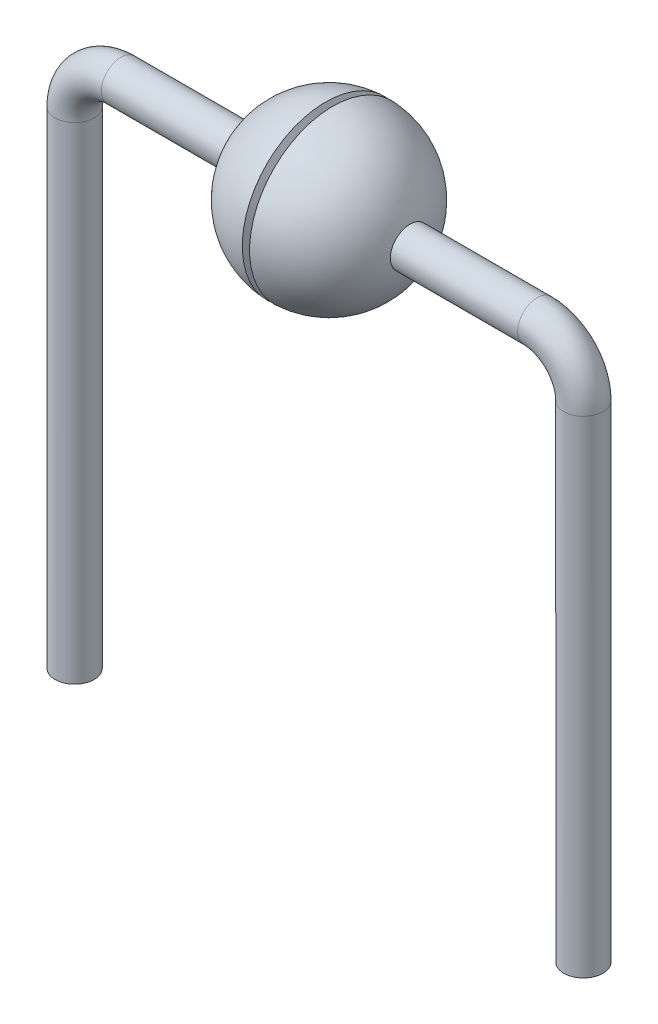
ISO-10303-21;
HEADER;
FILE_DESCRIPTION(('STEP AP214'),'2;1');
FILE_NAME('part.step','',(''),(''),'','','');
FILE_SCHEMA(('AUTOMOTIVE_DESIGN { 1 0 10303 214 1 1 1 1 }'));
ENDSEC;
DATA;
#1=APPLICATION_CONTEXT('core data for automotive mechanical design processes');
#2=APPLICATION_PROTOCOL_DEFINITION('international standard','automotive_design',2000,#1);
#3=PRODUCT_CONTEXT('',#1,'mechanical');
#4=PRODUCT('Part','Part','',(#3));
#5=PRODUCT_RELATED_PRODUCT_CATEGORY('part','',(#4));
#6=PRODUCT_DEFINITION_FORMATION('','',#4);
#7=PRODUCT_DEFINITION_CONTEXT('part definition',#1,'design');
#8=PRODUCT_DEFINITION('design','',#6,#7);
#9=PRODUCT_DEFINITION_SHAPE('','',#8);
#10=(LENGTH_UNIT() NAMED_UNIT(*) SI_UNIT(.MILLI.,.METRE.));
#11=(NAMED_UNIT(*) PLANE_ANGLE_UNIT() SI_UNIT($,.RADIAN.));
#12=(NAMED_UNIT(*) SI_UNIT($,.STERADIAN.) SOLID_ANGLE_UNIT());
#13=UNCERTAINTY_MEASURE_WITH_UNIT(LENGTH_MEASURE(1.E-05),#10,'distance_accuracy_value','');
#14=(GEOMETRIC_REPRESENTATION_CONTEXT(3) GLOBAL_UNCERTAINTY_ASSIGNED_CONTEXT((#13)) GLOBAL_UNIT_ASSIGNED_CONTEXT((#10,
#11,#12)) REPRESENTATION_CONTEXT('',''));
#15=CARTESIAN_POINT('',(0.,0.,0.));
#16=DIRECTION('',(0.,0.,1.));
#17=DIRECTION('',(1.,0.,0.));
#18=AXIS2_PLACEMENT_3D('',#15,#16,#17);
#19=CARTESIAN_POINT('',(0.,0.,0.));
#20=DIRECTION('',(-1.,0.,0.));
#21=DIRECTION('',(0.,0.,-1.));
#22=AXIS2_PLACEMENT_3D('',#19,#20,#21);
#23=SPHERICAL_SURFACE('',#22,1.8);
#24=CARTESIAN_POINT('',(-0.0757594654296964,0.,0.));
#25=DIRECTION('',(-1.,0.,0.));
#26=DIRECTION('',(0.,0.,1.));
#27=AXIS2_PLACEMENT_3D('',#24,#25,#26);
#28=CIRCLE('',#27,1.79840498870466);
#29=CARTESIAN_POINT('',(-0.0757594654296965,0.,-1.79840498870466));
#30=VERTEX_POINT('',#29);
#31=EDGE_CURVE('E51',#30,#30,#28,.T.);
#32=CARTESIAN_POINT('',(-1.74957838479417,0.,0.));
#33=DIRECTION('',(-1.,0.,0.));
#34=DIRECTION('',(0.,0.,1.));
#35=AXIS2_PLACEMENT_3D('',#32,#33,#34);
#36=CIRCLE('',#35,0.423054931966296);
#37=CARTESIAN_POINT('',(-1.74957838479417,0.,-0.423054931966299));
#38=VERTEX_POINT('',#37);
#39=EDGE_CURVE('E10',#38,#38,#36,.T.);
#40=CARTESIAN_POINT('',(-0.0757594654296965,0.,-1.79840498870466));
#41=CARTESIAN_POINT('',(-0.099952631636869,0.,-1.79738611513024));
#42=CARTESIAN_POINT('',(-0.124125188852358,0.,-1.79587849255321));
#43=CARTESIAN_POINT('',(-0.172389823168664,0.,-1.79188945530046));
#44=CARTESIAN_POINT('',(-0.196481900269483,0.,-1.78940804062473));
#45=CARTESIAN_POINT('',(-0.244546312225146,0.,-1.78347512508105));
#46=CARTESIAN_POINT('',(-0.268518647079991,0.,-1.7800236242131));
#47=CARTESIAN_POINT('',(-0.316304542533428,0.,-1.77215624692101));
#48=CARTESIAN_POINT('',(-0.340118103132021,0.,-1.76774037049687));
#49=CARTESIAN_POINT('',(-0.387547667219825,0.,-1.75795140937531));
#50=CARTESIAN_POINT('',(-0.411163670709036,0.,-1.75257832467788));
#51=CARTESIAN_POINT('',(-0.458159661972075,0.,-1.74088370363389));
#52=CARTESIAN_POINT('',(-0.481539649745902,0.,-1.73456216728732));
#53=CARTESIAN_POINT('',(-0.528025534652932,0.,-1.72098093596718));
#54=CARTESIAN_POINT('',(-0.551131431786133,0.,-1.71372124099362));
#55=CARTESIAN_POINT('',(-0.59703150702984,0.,-1.69827551544233));
#56=CARTESIAN_POINT('',(-0.619825685140346,0.,-1.69008948486461));
#57=CARTESIAN_POINT('',(-0.665065201548812,0.,-1.67280441909715));
#58=CARTESIAN_POINT('',(-0.687510539846772,0.,-1.66370538390742));
#59=CARTESIAN_POINT('',(-0.732015823945979,0.,-1.64460912691185));
#60=CARTESIAN_POINT('',(-0.754075769747226,0.,-1.634611905106));
#61=CARTESIAN_POINT('',(-0.79777434378482,0.,-1.61373555554697));
#62=CARTESIAN_POINT('',(-0.819412972021168,0.,-1.6028564277938));
#63=CARTESIAN_POINT('',(-0.862233671985881,0.,-1.58023398322186));
#64=CARTESIAN_POINT('',(-0.883415743714247,0.,-1.5684906664031));
#65=CARTESIAN_POINT('',(-0.92528883523116,0.,-1.54415896792806));
#66=CARTESIAN_POINT('',(-0.945979855019707,0.,-1.53157058627178));
#67=CARTESIAN_POINT('',(-0.986837146913218,0.,-1.50556925855575));
#68=CARTESIAN_POINT('',(-1.00700341901818,0.,-1.492156312496));
#69=CARTESIAN_POINT('',(-1.04677837436295,0.,-1.46452769922662));
#70=CARTESIAN_POINT('',(-1.06638705760276,0.,-1.45031203201701));
#71=CARTESIAN_POINT('',(-1.10501490208037,0.,-1.4211011269492));
#72=CARTESIAN_POINT('',(-1.12403406331818,0.,-1.406105889091));
#73=CARTESIAN_POINT('',(-1.16145189070344,0.,-1.37536026277385));
#74=CARTESIAN_POINT('',(-1.1798505568509,0.,-1.3596098743149));
#75=CARTESIAN_POINT('',(-1.21599743145592,0.,-1.32737959662208));
#76=CARTESIAN_POINT('',(-1.23374563991347,0.,-1.3108997073882));
#77=CARTESIAN_POINT('',(-1.2685626958226,0.,-1.27723726597812));
#78=CARTESIAN_POINT('',(-1.28563154327417,0.,-1.2600547138019));
#79=CARTESIAN_POINT('',(-1.31906208020844,0.,-1.22501492864054));
#80=CARTESIAN_POINT('',(-1.33542376969113,0.,-1.20715769565538));
#81=CARTESIAN_POINT('',(-1.36741334534557,0.,-1.1707976297408));
#82=CARTESIAN_POINT('',(-1.38304123151732,0.,-1.15229479681137));
#83=CARTESIAN_POINT('',(-1.41353775022209,0.,-1.11467366324567));
#84=CARTESIAN_POINT('',(-1.42840638275512,0.,-1.09555536260941));
#85=CARTESIAN_POINT('',(-1.45736018031166,0.,-1.05673442816826));
#86=CARTESIAN_POINT('',(-1.47144534533517,0.,-1.03703179436336));
#87=CARTESIAN_POINT('',(-1.49880926990546,0.,-0.997074279724639));
#88=CARTESIAN_POINT('',(-1.51208802945223,0.,-0.976819398890803));
#89=CARTESIAN_POINT('',(-1.53781751830874,0.,-0.935790375667727));
#90=CARTESIAN_POINT('',(-1.55026824761849,0.,-0.915016233278487));
#91=CARTESIAN_POINT('',(-1.57432139985639,0.,-0.87298251808932));
#92=CARTESIAN_POINT('',(-1.58592382278455,0.,-0.851722945289394));
#93=CARTESIAN_POINT('',(-1.60826146703245,0.,-0.808752990795412));
#94=CARTESIAN_POINT('',(-1.61899668835219,0.,-0.787042609101356));
#95=CARTESIAN_POINT('',(-1.63958244852545,0.,-0.743206393089398));
#96=CARTESIAN_POINT('',(-1.64943298737898,0.,-0.721080558771497));
#97=CARTESIAN_POINT('',(-1.66823333459683,0.,-0.676449468107176));
#98=CARTESIAN_POINT('',(-1.67718314296115,0.,-0.653944211760757));
#99=CARTESIAN_POINT('',(-1.6941674774756,0.,-0.608590933920623));
#100=CARTESIAN_POINT('',(-1.70220200362573,0.,-0.585742912426909));
#101=CARTESIAN_POINT('',(-1.71734260267004,0.,-0.539741288063507));
#102=CARTESIAN_POINT('',(-1.72444867556422,0.,-0.516587685193819));
#103=CARTESIAN_POINT('',(-1.7377211191089,0.,-0.470012696345255));
#104=CARTESIAN_POINT('',(-1.7438874897594,0.,-0.446591310366378));
#105=CARTESIAN_POINT('',(-1.74957838479417,0.,-0.423054931966299));
#106=B_SPLINE_CURVE_WITH_KNOTS('',3,(#40,#41,#42,#43,#44,#45,#46,#47,#48,#49,#50,#51,#52,#53,
#54,#55,#56,#57,#58,#59,#60,#61,#62,#63,#64,#65,#66,#67,#68,#69,#70,#71,#72,#73,#74,#75,#76,#77,
#78,#79,#80,#81,#82,#83,#84,#85,#86,#87,#88,#89,#90,#91,#92,#93,#94,#95,#96,#97,#98,#99,#100,
#101,#102,#103,#104,#105),.UNSPECIFIED.,.F.,.F.,(4,2,2,2,2,2,2,2,2,2,2,2,2,2,2,2,2,2,2,2,2,2,2,
2,2,2,2,2,2,2,2,2,4),(0.,0.0726388701913701,0.14527774038274,0.21791661057411,0.29055548076548,
0.363194350956851,0.435833221148221,0.508472091339591,0.581110961530961,0.653749831722331,
0.726388701913701,0.799027572105071,0.871666442296441,0.944305312487812,1.01694418267918,
1.08958305287055,1.16222192306192,1.23486079325329,1.30749966344466,1.38013853363603,
1.4527774038274,1.52541627401877,1.59805514421014,1.67069401440151,1.74333288459288,
1.81597175478425,1.88861062497562,1.96124949516699,2.03388836535836,2.10652723554973,
2.1791661057411,2.25180497593247,2.32444384612384),.UNSPECIFIED.);
#107=EDGE_CURVE('BSEAM37',#30,#38,#106,.T.);
#108=ORIENTED_EDGE('',*,*,#31,.T.);
#109=ORIENTED_EDGE('',*,*,#39,.F.);
#110=ORIENTED_EDGE('',*,*,#107,.T.);
#111=ORIENTED_EDGE('',*,*,#107,.F.);
#112=EDGE_LOOP('',(#108,#110,#109,#111));
#113=FACE_BOUND('',#112,.T.);
#114=ADVANCED_FACE('F37',(#113),#23,.T.);
#115=CARTESIAN_POINT('',(0.,0.,0.));
#116=DIRECTION('',(-1.,0.,0.));
#117=DIRECTION('',(0.,0.,-1.));
#118=AXIS2_PLACEMENT_3D('',#115,#116,#117);
#119=SPHERICAL_SURFACE('',#118,1.8);
#120=CARTESIAN_POINT('',(1.74957838479417,0.,0.));
#121=DIRECTION('',(-1.,0.,0.));
#122=DIRECTION('',(0.,0.,1.));
#123=AXIS2_PLACEMENT_3D('',#120,#121,#122);
#124=CIRCLE('',#123,0.423054931966297);
#125=CARTESIAN_POINT('',(1.74957838479417,0.,-0.423054931966296));
#126=VERTEX_POINT('',#125);
#127=EDGE_CURVE('E72',#126,#126,#124,.T.);
#128=CARTESIAN_POINT('',(0.0809607239177813,0.,0.));
#129=DIRECTION('',(-1.,0.,0.));
#130=DIRECTION('',(0.,0.,1.));
#131=AXIS2_PLACEMENT_3D('',#128,#129,#130);
#132=CIRCLE('',#131,1.79817834521015);
#133=CARTESIAN_POINT('',(0.0809607239177813,0.,-1.79817834521015));
#134=VERTEX_POINT('',#133);
#135=EDGE_CURVE('E43',#134,#134,#132,.T.);
#136=CARTESIAN_POINT('',(1.74957838479417,0.,-0.423054931966296));
#137=CARTESIAN_POINT('',(1.74390023330024,0.,-0.44653859756378));
#138=CARTESIAN_POINT('',(1.73774873595899,0.,-0.469907785955478));
#139=CARTESIAN_POINT('',(1.7245102187887,0.,-0.516379662139358));
#140=CARTESIAN_POINT('',(1.71742319895966,0.,-0.539482349931541));
#141=CARTESIAN_POINT('',(1.70232480602064,0.,-0.585383678728447));
#142=CARTESIAN_POINT('',(1.69431343291066,0.,-0.608182319733171));
#143=CARTESIAN_POINT('',(1.67737940760938,0.,-0.653438617468616));
#144=CARTESIAN_POINT('',(1.66845675541807,0.,-0.675896274199336));
#145=CARTESIAN_POINT('',(1.64971461465688,0.,-0.720434187695304));
#146=CARTESIAN_POINT('',(1.63989512608699,0.,-0.742514444460551));
#147=CARTESIAN_POINT('',(1.61937523843192,0.,-0.786261762500008));
#148=CARTESIAN_POINT('',(1.60867483934674,0.,-0.807928823774217));
#149=CARTESIAN_POINT('',(1.58641047686894,0.,-0.850814622965795));
#150=CARTESIAN_POINT('',(1.57484651347633,0.,-0.872033360883163));
#151=CARTESIAN_POINT('',(1.55087377072699,0.,-0.913988112929484));
#152=CARTESIAN_POINT('',(1.53846499137028,0.,-0.934724127058436));
#153=CARTESIAN_POINT('',(1.51282273411983,0.,-0.975679813545079));
#154=CARTESIAN_POINT('',(1.4995892562261,0.,-0.99589948590277));
#155=CARTESIAN_POINT('',(1.47231905650915,0.,-1.03578970801817));
#156=CARTESIAN_POINT('',(1.45828233468593,0.,-1.05546025777589));
#157=CARTESIAN_POINT('',(1.42942840392429,0.,-1.09422034410784));
#158=CARTESIAN_POINT('',(1.41461119498587,0.,-1.11330988068208));
#159=CARTESIAN_POINT('',(1.38422031217183,0.,-1.1508769920255));
#160=CARTESIAN_POINT('',(1.36864663829621,0.,-1.16935456679469));
#161=CARTESIAN_POINT('',(1.33676807419021,0.,-1.20566779803939));
#162=CARTESIAN_POINT('',(1.32046318395983,0.,-1.22350345451491));
#163=CARTESIAN_POINT('',(1.28714862120098,0.,-1.25850393338424));
#164=CARTESIAN_POINT('',(1.2701389486725,0.,-1.27566875577805));
#165=CARTESIAN_POINT('',(1.23544239799155,0.,-1.30929973827543));
#166=CARTESIAN_POINT('',(1.21775551983908,0.,-1.325765898379));
#167=CARTESIAN_POINT('',(1.18173323249363,0.,-1.35797286078308));
#168=CARTESIAN_POINT('',(1.16339782330067,0.,-1.37371366308358));
#169=CARTESIAN_POINT('',(1.12610819987887,0.,-1.40444439034402));
#170=CARTESIAN_POINT('',(1.10715398565005,0.,-1.41943431530397));
#171=CARTESIAN_POINT('',(1.06865748138947,0.,-1.44863898569434));
#172=CARTESIAN_POINT('',(1.04911519135772,0.,-1.46285373112478));
#173=CARTESIAN_POINT('',(1.00947421813323,0.,-1.49048499701524));
#174=CARTESIAN_POINT('',(0.989375534940481,0.,-1.50390151747527));
#175=CARTESIAN_POINT('',(0.948654360079914,0.,-1.52991458209425));
#176=CARTESIAN_POINT('',(0.928031868412094,0.,-1.5425111262532));
#177=CARTESIAN_POINT('',(0.886296510503846,0.,-1.56686381631328));
#178=CARTESIAN_POINT('',(0.865183644263418,0.,-1.57861996221441));
#179=CARTESIAN_POINT('',(0.822501766124844,0.,-1.60127279628589));
#180=CARTESIAN_POINT('',(0.800932754226698,0.,-1.61216948445623));
#181=CARTESIAN_POINT('',(0.757373553206563,0.,-1.633085736973));
#182=CARTESIAN_POINT('',(0.735383364084574,0.,-1.64310530131943));
#183=CARTESIAN_POINT('',(0.691017459878785,0.,-1.66225106213015));
#184=CARTESIAN_POINT('',(0.668641744794986,0.,-1.67137725859444));
#185=CARTESIAN_POINT('',(0.623541064952169,0.,-1.68872148790007));
#186=CARTESIAN_POINT('',(0.600816100193152,0.,-1.6969395207414));
#187=CARTESIAN_POINT('',(0.555053763515562,0.,-1.71245409956265));
#188=CARTESIAN_POINT('',(0.532016391596989,0.,-1.71975064554257));
#189=CARTESIAN_POINT('',(0.485666589551624,0.,-1.73341042076761));
#190=CARTESIAN_POINT('',(0.462354159424832,0.,-1.73977365001273));
#191=CARTESIAN_POINT('',(0.415492036033817,0.,-1.75155647719076));
#192=CARTESIAN_POINT('',(0.391942342769593,0.,-1.75697607512367));
#193=CARTESIAN_POINT('',(0.344643872141503,0.,-1.76686284684807));
#194=CARTESIAN_POINT('',(0.320895094777637,0.,-1.77133002063956));
#195=CARTESIAN_POINT('',(0.273236960333717,0.,-1.77930472558388));
#196=CARTESIAN_POINT('',(0.249327603253664,0.,-1.78281225673671));
#197=CARTESIAN_POINT('',(0.201387064456192,0.,-1.78886190089738));
#198=CARTESIAN_POINT('',(0.177355882738772,0.,-1.79140401390523));
#199=CARTESIAN_POINT('',(0.129210683236434,0.,-1.79551903247118));
#200=CARTESIAN_POINT('',(0.105096665451515,0.,-1.79709193802928));
#201=CARTESIAN_POINT('',(0.0809607239177812,0.,-1.79817834521015));
#202=B_SPLINE_CURVE_WITH_KNOTS('',3,(#136,#137,#138,#139,#140,#141,#142,#143,#144,#145,#146,
#147,#148,#149,#150,#151,#152,#153,#154,#155,#156,#157,#158,#159,#160,#161,#162,#163,#164,#165,
#166,#167,#168,#169,#170,#171,#172,#173,#174,#175,#176,#177,#178,#179,#180,#181,#182,#183,#184,
#185,#186,#187,#188,#189,#190,#191,#192,#193,#194,#195,#196,#197,#198,#199,#200,#201),
.UNSPECIFIED.,.F.,.F.,(4,2,2,2,2,2,2,2,2,2,2,2,2,2,2,2,2,2,2,2,2,2,2,2,2,2,2,2,2,2,2,2,4),(0.,
0.0724762096166364,0.144952419233273,0.217428628849909,0.289904838466545,0.362381048083181,
0.434857257699818,0.507333467316454,0.57980967693309,0.652285886549726,0.724762096166362,
0.797238305782999,0.869714515399635,0.942190725016271,1.01466693463291,1.08714314424954,
1.15961935386618,1.23209556348282,1.30457177309945,1.37704798271609,1.44952419233273,
1.52200040194936,1.594476611566,1.66695282118263,1.73942903079927,1.81190524041591,
1.88438145003254,1.95685765964918,2.02933386926582,2.10181007888245,2.17428628849909,
2.24676249811572,2.31923870773236),.UNSPECIFIED.);
#203=EDGE_CURVE('BSEAM102',#126,#134,#202,.T.);
#204=ORIENTED_EDGE('',*,*,#127,.T.);
#205=ORIENTED_EDGE('',*,*,#135,.F.);
#206=ORIENTED_EDGE('',*,*,#203,.T.);
#207=ORIENTED_EDGE('',*,*,#203,.F.);
#208=EDGE_LOOP('',(#204,#206,#205,#207));
#209=FACE_BOUND('',#208,.T.);
#210=ADVANCED_FACE('F102',(#209),#119,.T.);
#211=CARTESIAN_POINT('',(0.,0.,0.));
#212=DIRECTION('',(1.,0.,0.));
#213=DIRECTION('',(0.,0.,-1.));
#214=AXIS2_PLACEMENT_3D('',#211,#212,#213);
#215=CONICAL_SURFACE('',#214,1.64585670640349,1.08225834723102);
#216=ORIENTED_EDGE('',*,*,#135,.T.);
#217=EDGE_LOOP('',(#216));
#218=FACE_BOUND('',#217,.T.);
#219=CARTESIAN_POINT('',(0.,0.,0.));
#220=DIRECTION('',(-1.,0.,0.));
#221=DIRECTION('',(0.,0.,1.));
#222=AXIS2_PLACEMENT_3D('',#219,#220,#221);
#223=CIRCLE('',#222,1.64585670640349);
#224=CARTESIAN_POINT('',(0.,0.,1.6458567064035));
#225=VERTEX_POINT('',#224);
#226=EDGE_CURVE('E47',#225,#225,#223,.T.);
#227=ORIENTED_EDGE('',*,*,#226,.F.);
#228=EDGE_LOOP('',(#227));
#229=FACE_BOUND('',#228,.T.);
#230=ADVANCED_FACE('F107',(#218,#229),#215,.T.);
#231=CARTESIAN_POINT('',(-0.0757594654296964,0.,0.));
#232=DIRECTION('',(-1.,0.,0.));
#233=DIRECTION('',(0.,0.,1.));
#234=AXIS2_PLACEMENT_3D('',#231,#232,#233);
#235=CONICAL_SURFACE('',#234,1.79840498870466,1.10985144232575);
#236=ORIENTED_EDGE('',*,*,#226,.T.);
#237=EDGE_LOOP('',(#236));
#238=FACE_BOUND('',#237,.T.);
#239=ORIENTED_EDGE('',*,*,#31,.F.);
#240=EDGE_LOOP('',(#239));
#241=FACE_BOUND('',#240,.T.);
#242=ADVANCED_FACE('F112',(#238,#241),#235,.T.);
#243=CARTESIAN_POINT('',(-5.5,-0.999999999999999,0.));
#244=DIRECTION('',(0.,-1.,0.));
#245=DIRECTION('',(0.,0.,-1.));
#246=AXIS2_PLACEMENT_3D('',#243,#244,#245);
#247=CYLINDRICAL_SURFACE('',#246,0.423054931966297);
#248=CARTESIAN_POINT('',(-5.5,-0.999999999999999,0.));
#249=DIRECTION('',(0.,-1.,0.));
#250=DIRECTION('',(0.,0.,1.));
#251=AXIS2_PLACEMENT_3D('',#248,#249,#250);
#252=CIRCLE('',#251,0.423054931966297);
#253=CARTESIAN_POINT('',(-5.9230549319663,-0.999999999999999,0.));
#254=VERTEX_POINT('',#253);
#255=EDGE_CURVE('E59',#254,#254,#252,.T.);
#256=ORIENTED_EDGE('',*,*,#255,.T.);
#257=EDGE_LOOP('',(#256));
#258=FACE_BOUND('',#257,.T.);
#259=CARTESIAN_POINT('',(-5.5,-11.514871197813,0.));
#260=DIRECTION('',(0.,-1.,0.));
#261=DIRECTION('',(0.,0.,1.));
#262=AXIS2_PLACEMENT_3D('',#259,#260,#261);
#263=CIRCLE('',#262,0.423054931966297);
#264=CARTESIAN_POINT('',(-5.5,-11.514871197813,0.423054931966297));
#265=VERTEX_POINT('',#264);
#266=EDGE_CURVE('E56',#265,#265,#263,.T.);
#267=ORIENTED_EDGE('',*,*,#266,.F.);
#268=EDGE_LOOP('',(#267));
#269=FACE_BOUND('',#268,.T.);
#270=ADVANCED_FACE('F114',(#258,#269),#247,.T.);
#271=CARTESIAN_POINT('',(-4.5,-1.,0.));
#272=DIRECTION('',(0.,0.,1.));
#273=DIRECTION('',(1.,0.,0.));
#274=AXIS2_PLACEMENT_3D('',#271,#272,#273);
#275=TOROIDAL_SURFACE('',#274,0.999999999999999,0.423054931966297);
#276=CARTESIAN_POINT('',(-4.5,0.,0.));
#277=DIRECTION('',(-1.,0.,0.));
#278=DIRECTION('',(0.,0.,1.));
#279=AXIS2_PLACEMENT_3D('',#276,#277,#278);
#280=CIRCLE('',#279,0.423054931966297);
#281=CARTESIAN_POINT('',(-4.5,0.423054931966296,0.));
#282=VERTEX_POINT('',#281);
#283=EDGE_CURVE('E62',#282,#282,#280,.T.);
#284=CARTESIAN_POINT('',(-4.5,-1.,0.));
#285=DIRECTION('',(0.,0.,1.));
#286=DIRECTION('',(1.,0.,0.));
#287=AXIS2_PLACEMENT_3D('',#284,#285,#286);
#288=CIRCLE('',#287,1.4230549319663);
#289=EDGE_CURVE('',#282,#254,#288,.T.);
#290=ORIENTED_EDGE('',*,*,#283,.T.);
#291=ORIENTED_EDGE('',*,*,#255,.F.);
#292=ORIENTED_EDGE('',*,*,#289,.T.);
#293=ORIENTED_EDGE('',*,*,#289,.F.);
#294=EDGE_LOOP('',(#290,#292,#291,#293));
#295=FACE_BOUND('',#294,.T.);
#296=ADVANCED_FACE('F121',(#295),#275,.T.);
#297=CARTESIAN_POINT('',(-4.5,0.,0.));
#298=DIRECTION('',(1.,0.,0.));
#299=DIRECTION('',(0.,1.,0.));
#300=AXIS2_PLACEMENT_3D('',#297,#298,#299);
#301=CYLINDRICAL_SURFACE('',#300,0.423054931966297);
#302=ORIENTED_EDGE('',*,*,#283,.F.);
#303=EDGE_LOOP('',(#302));
#304=FACE_BOUND('',#303,.T.);
#305=ORIENTED_EDGE('',*,*,#39,.T.);
#306=EDGE_LOOP('',(#305));
#307=FACE_BOUND('',#306,.T.);
#308=ADVANCED_FACE('F128',(#304,#307),#301,.T.);
#309=CARTESIAN_POINT('',(-5.5,-11.514871197813,0.));
#310=DIRECTION('',(0.,-1.,0.));
#311=DIRECTION('',(0.,0.,1.));
#312=AXIS2_PLACEMENT_3D('',#309,#310,#311);
#313=PLANE('',#312);
#314=ORIENTED_EDGE('',*,*,#266,.T.);
#315=EDGE_LOOP('',(#314));
#316=FACE_BOUND('',#315,.T.);
#317=ADVANCED_FACE('F90',(#316),#313,.T.);
#318=CARTESIAN_POINT('',(5.5,-0.999999999999999,0.));
#319=DIRECTION('',(0.,-1.,0.));
#320=DIRECTION('',(0.,0.,-1.));
#321=AXIS2_PLACEMENT_3D('',#318,#319,#320);
#322=CYLINDRICAL_SURFACE('',#321,0.423054931966297);
#323=CARTESIAN_POINT('',(5.5,-0.999999999999999,0.));
#324=DIRECTION('',(0.,1.,0.));
#325=DIRECTION('',(0.,0.,1.));
#326=AXIS2_PLACEMENT_3D('',#323,#324,#325);
#327=CIRCLE('',#326,0.423054931966297);
#328=CARTESIAN_POINT('',(5.9230549319663,-0.999999999999999,0.));
#329=VERTEX_POINT('',#328);
#330=EDGE_CURVE('E68',#329,#329,#327,.T.);
#331=ORIENTED_EDGE('',*,*,#330,.F.);
#332=EDGE_LOOP('',(#331));
#333=FACE_BOUND('',#332,.T.);
#334=CARTESIAN_POINT('',(5.5,-11.514871197813,0.));
#335=DIRECTION('',(0.,1.,0.));
#336=DIRECTION('',(0.,0.,1.));
#337=AXIS2_PLACEMENT_3D('',#334,#335,#336);
#338=CIRCLE('',#337,0.423054931966297);
#339=CARTESIAN_POINT('',(5.5,-11.514871197813,0.423054931966297));
#340=VERTEX_POINT('',#339);
#341=EDGE_CURVE('E65',#340,#340,#338,.T.);
#342=ORIENTED_EDGE('',*,*,#341,.T.);
#343=EDGE_LOOP('',(#342));
#344=FACE_BOUND('',#343,.T.);
#345=ADVANCED_FACE('F84',(#333,#344),#322,.T.);
#346=CARTESIAN_POINT('',(4.5,-1.,0.));
#347=DIRECTION('',(0.,0.,-1.));
#348=DIRECTION('',(-1.,0.,0.));
#349=AXIS2_PLACEMENT_3D('',#346,#347,#348);
#350=TOROIDAL_SURFACE('',#349,0.999999999999999,0.423054931966297);
#351=CARTESIAN_POINT('',(4.5,0.,0.));
#352=DIRECTION('',(-1.,0.,0.));
#353=DIRECTION('',(0.,0.,1.));
#354=AXIS2_PLACEMENT_3D('',#351,#352,#353);
#355=CIRCLE('',#354,0.423054931966297);
#356=CARTESIAN_POINT('',(4.5,0.423054931966296,0.));
#357=VERTEX_POINT('',#356);
#358=EDGE_CURVE('E71',#357,#357,#355,.T.);
#359=CARTESIAN_POINT('',(4.5,-1.,0.));
#360=DIRECTION('',(0.,0.,-1.));
#361=DIRECTION('',(-1.,0.,0.));
#362=AXIS2_PLACEMENT_3D('',#359,#360,#361);
#363=CIRCLE('',#362,1.4230549319663);
#364=EDGE_CURVE('',#357,#329,#363,.T.);
#365=ORIENTED_EDGE('',*,*,#358,.F.);
#366=ORIENTED_EDGE('',*,*,#330,.T.);
#367=ORIENTED_EDGE('',*,*,#364,.T.);
#368=ORIENTED_EDGE('',*,*,#364,.F.);
#369=EDGE_LOOP('',(#365,#367,#366,#368));
#370=FACE_BOUND('',#369,.T.);
#371=ADVANCED_FACE('F81',(#370),#350,.T.);
#372=CARTESIAN_POINT('',(4.5,0.,0.));
#373=DIRECTION('',(-1.,0.,0.));
#374=DIRECTION('',(0.,-1.,0.));
#375=AXIS2_PLACEMENT_3D('',#372,#373,#374);
#376=CYLINDRICAL_SURFACE('',#375,0.423054931966297);
#377=ORIENTED_EDGE('',*,*,#358,.T.);
#378=EDGE_LOOP('',(#377));
#379=FACE_BOUND('',#378,.T.);
#380=ORIENTED_EDGE('',*,*,#127,.F.);
#381=EDGE_LOOP('',(#380));
#382=FACE_BOUND('',#381,.T.);
#383=ADVANCED_FACE('F78',(#379,#382),#376,.T.);
#384=CARTESIAN_POINT('',(5.5,-11.514871197813,0.));
#385=DIRECTION('',(0.,-1.,0.));
#386=DIRECTION('',(0.,0.,1.));
#387=AXIS2_PLACEMENT_3D('',#384,#385,#386);
#388=PLANE('',#387);
#389=ORIENTED_EDGE('',*,*,#341,.F.);
#390=EDGE_LOOP('',(#389));
#391=FACE_BOUND('',#390,.T.);
#392=ADVANCED_FACE('F94',(#391),#388,.T.);
#393=CLOSED_SHELL('',(#114,#210,#230,#242,#270,#296,#308,#317,#345,#371,#383,#392));
#394=MANIFOLD_SOLID_BREP('B2',#393);
#395=ADVANCED_BREP_SHAPE_REPRESENTATION('',(#18,#394),#14);
#396=SHAPE_DEFINITION_REPRESENTATION(#9,#395);
ENDSEC;
END-ISO-10303-21;
